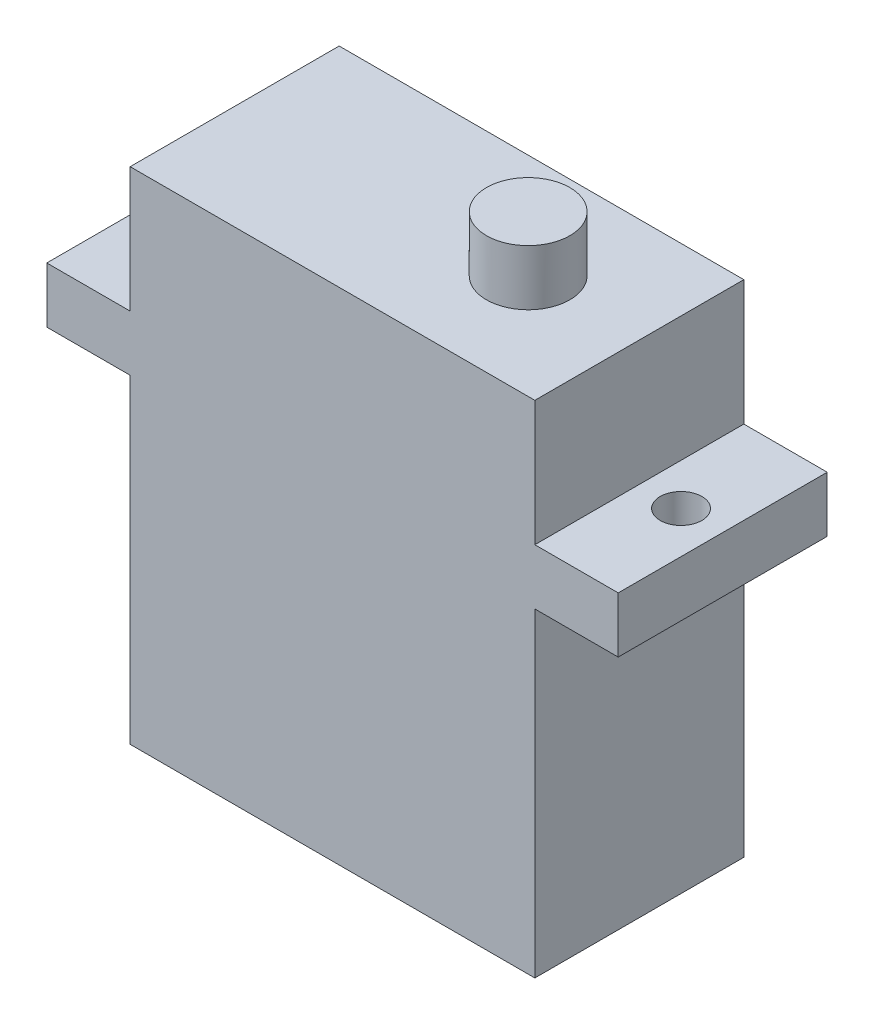
ISO-10303-21;
HEADER;
FILE_DESCRIPTION(('STEP AP214'),'2;1');
FILE_NAME('part.step','',(''),(''),'','','');
FILE_SCHEMA(('AUTOMOTIVE_DESIGN { 1 0 10303 214 1 1 1 1 }'));
ENDSEC;
DATA;
#1=APPLICATION_CONTEXT('core data for automotive mechanical design processes');
#2=APPLICATION_PROTOCOL_DEFINITION('international standard','automotive_design',2000,#1);
#3=PRODUCT_CONTEXT('',#1,'mechanical');
#4=PRODUCT('Part','Part','',(#3));
#5=PRODUCT_RELATED_PRODUCT_CATEGORY('part','',(#4));
#6=PRODUCT_DEFINITION_FORMATION('','',#4);
#7=PRODUCT_DEFINITION_CONTEXT('part definition',#1,'design');
#8=PRODUCT_DEFINITION('design','',#6,#7);
#9=PRODUCT_DEFINITION_SHAPE('','',#8);
#10=(LENGTH_UNIT() NAMED_UNIT(*) SI_UNIT(.MILLI.,.METRE.));
#11=(NAMED_UNIT(*) PLANE_ANGLE_UNIT() SI_UNIT($,.RADIAN.));
#12=(NAMED_UNIT(*) SI_UNIT($,.STERADIAN.) SOLID_ANGLE_UNIT());
#13=UNCERTAINTY_MEASURE_WITH_UNIT(LENGTH_MEASURE(1.E-05),#10,'distance_accuracy_value','');
#14=(GEOMETRIC_REPRESENTATION_CONTEXT(3) GLOBAL_UNCERTAINTY_ASSIGNED_CONTEXT((#13)) GLOBAL_UNIT_ASSIGNED_CONTEXT((#10,
#11,#12)) REPRESENTATION_CONTEXT('',''));
#15=CARTESIAN_POINT('',(0.,0.,0.));
#16=DIRECTION('',(0.,0.,1.));
#17=DIRECTION('',(1.,0.,0.));
#18=AXIS2_PLACEMENT_3D('',#15,#16,#17);
#19=CARTESIAN_POINT('',(-11.557,28.575,-5.969));
#20=DIRECTION('',(1.,0.,0.));
#21=DIRECTION('',(0.,0.,-1.));
#22=AXIS2_PLACEMENT_3D('',#19,#20,#21);
#23=PLANE('',#22);
#24=DIRECTION('',(0.,0.,1.));
#25=VECTOR('',#24,1.);
#26=CARTESIAN_POINT('',(-11.557,18.25625,-5.969));
#27=LINE('',#26,#25);
#28=CARTESIAN_POINT('',(-11.557,18.25625,-5.969));
#29=VERTEX_POINT('',#28);
#30=CARTESIAN_POINT('',(-11.557,18.25625,5.969));
#31=VERTEX_POINT('',#30);
#32=EDGE_CURVE('E131',#29,#31,#27,.T.);
#33=ORIENTED_EDGE('',*,*,#32,.F.);
#34=DIRECTION('',(0.,-1.,0.));
#35=VECTOR('',#34,1.);
#36=CARTESIAN_POINT('',(-11.557,28.575,-5.969));
#37=LINE('',#36,#35);
#38=CARTESIAN_POINT('',(-11.557,0.,-5.969));
#39=VERTEX_POINT('',#38);
#40=EDGE_CURVE('E144',#29,#39,#37,.T.);
#41=ORIENTED_EDGE('',*,*,#40,.T.);
#42=DIRECTION('',(0.,0.,1.));
#43=VECTOR('',#42,1.);
#44=CARTESIAN_POINT('',(-11.557,0.,-5.969));
#45=LINE('',#44,#43);
#46=CARTESIAN_POINT('',(-11.557,0.,5.969));
#47=VERTEX_POINT('',#46);
#48=EDGE_CURVE('E187',#39,#47,#45,.T.);
#49=ORIENTED_EDGE('',*,*,#48,.T.);
#50=DIRECTION('',(0.,-1.,0.));
#51=VECTOR('',#50,1.);
#52=CARTESIAN_POINT('',(-11.557,28.575,5.969));
#53=LINE('',#52,#51);
#54=EDGE_CURVE('E146',#31,#47,#53,.T.);
#55=ORIENTED_EDGE('',*,*,#54,.F.);
#56=EDGE_LOOP('',(#33,#41,#49,#55));
#57=FACE_BOUND('',#56,.T.);
#58=ADVANCED_FACE('F39',(#57),#23,.F.);
#59=CARTESIAN_POINT('',(11.557,28.575,-5.969));
#60=DIRECTION('',(1.,0.,0.));
#61=DIRECTION('',(0.,0.,-1.));
#62=AXIS2_PLACEMENT_3D('',#59,#60,#61);
#63=PLANE('',#62);
#64=DIRECTION('',(0.,-1.,0.));
#65=VECTOR('',#64,1.);
#66=CARTESIAN_POINT('',(11.557,28.575,-5.969));
#67=LINE('',#66,#65);
#68=CARTESIAN_POINT('',(11.557,18.25625,-5.969));
#69=VERTEX_POINT('',#68);
#70=CARTESIAN_POINT('',(11.557,0.,-5.969));
#71=VERTEX_POINT('',#70);
#72=EDGE_CURVE('E158',#69,#71,#67,.T.);
#73=ORIENTED_EDGE('',*,*,#72,.F.);
#74=DIRECTION('',(0.,0.,1.));
#75=VECTOR('',#74,1.);
#76=CARTESIAN_POINT('',(11.557,18.25625,-5.969));
#77=LINE('',#76,#75);
#78=CARTESIAN_POINT('',(11.557,18.25625,5.969));
#79=VERTEX_POINT('',#78);
#80=EDGE_CURVE('E179',#69,#79,#77,.T.);
#81=ORIENTED_EDGE('',*,*,#80,.T.);
#82=DIRECTION('',(0.,-1.,0.));
#83=VECTOR('',#82,1.);
#84=CARTESIAN_POINT('',(11.557,28.575,5.969));
#85=LINE('',#84,#83);
#86=CARTESIAN_POINT('',(11.557,0.,5.969));
#87=VERTEX_POINT('',#86);
#88=EDGE_CURVE('E165',#79,#87,#85,.T.);
#89=ORIENTED_EDGE('',*,*,#88,.T.);
#90=DIRECTION('',(0.,0.,1.));
#91=VECTOR('',#90,1.);
#92=CARTESIAN_POINT('',(11.557,0.,-5.969));
#93=LINE('',#92,#91);
#94=EDGE_CURVE('E178',#71,#87,#93,.T.);
#95=ORIENTED_EDGE('',*,*,#94,.F.);
#96=EDGE_LOOP('',(#73,#81,#89,#95));
#97=FACE_BOUND('',#96,.T.);
#98=ADVANCED_FACE('F176',(#97),#63,.T.);
#99=CARTESIAN_POINT('',(-11.557,28.575,5.969));
#100=DIRECTION('',(0.,0.,-1.));
#101=DIRECTION('',(-1.,0.,0.));
#102=AXIS2_PLACEMENT_3D('',#99,#100,#101);
#103=PLANE('',#102);
#104=DIRECTION('',(1.,0.,0.));
#105=VECTOR('',#104,1.);
#106=CARTESIAN_POINT('',(-11.557,0.,5.969));
#107=LINE('',#106,#105);
#108=EDGE_CURVE('E182',#47,#87,#107,.T.);
#109=ORIENTED_EDGE('',*,*,#108,.T.);
#110=ORIENTED_EDGE('',*,*,#88,.F.);
#111=DIRECTION('',(1.,0.,0.));
#112=VECTOR('',#111,1.);
#113=CARTESIAN_POINT('',(11.557,18.25625,5.969));
#114=LINE('',#113,#112);
#115=CARTESIAN_POINT('',(16.3195,18.25625,5.969));
#116=VERTEX_POINT('',#115);
#117=EDGE_CURVE('E62',#79,#116,#114,.T.);
#118=ORIENTED_EDGE('',*,*,#117,.T.);
#119=DIRECTION('',(0.,-1.,0.));
#120=VECTOR('',#119,1.);
#121=CARTESIAN_POINT('',(16.3195,21.43125,5.969));
#122=LINE('',#121,#120);
#123=CARTESIAN_POINT('',(16.3195,21.43125,5.969));
#124=VERTEX_POINT('',#123);
#125=EDGE_CURVE('E238',#124,#116,#122,.T.);
#126=ORIENTED_EDGE('',*,*,#125,.F.);
#127=DIRECTION('',(1.,0.,0.));
#128=VECTOR('',#127,1.);
#129=CARTESIAN_POINT('',(11.557,21.43125,5.969));
#130=LINE('',#129,#128);
#131=CARTESIAN_POINT('',(11.557,21.43125,5.969));
#132=VERTEX_POINT('',#131);
#133=EDGE_CURVE('E212',#132,#124,#130,.T.);
#134=ORIENTED_EDGE('',*,*,#133,.F.);
#135=CARTESIAN_POINT('',(11.557,28.575,5.969));
#136=VERTEX_POINT('',#135);
#137=EDGE_CURVE('E47',#136,#132,#85,.T.);
#138=ORIENTED_EDGE('',*,*,#137,.F.);
#139=DIRECTION('',(1.,0.,0.));
#140=VECTOR('',#139,1.);
#141=CARTESIAN_POINT('',(-11.557,28.575,5.969));
#142=LINE('',#141,#140);
#143=CARTESIAN_POINT('',(-11.557,28.575,5.969));
#144=VERTEX_POINT('',#143);
#145=EDGE_CURVE('E190',#144,#136,#142,.T.);
#146=ORIENTED_EDGE('',*,*,#145,.F.);
#147=CARTESIAN_POINT('',(-11.557,21.43125,5.969));
#148=VERTEX_POINT('',#147);
#149=EDGE_CURVE('E155',#144,#148,#53,.T.);
#150=ORIENTED_EDGE('',*,*,#149,.T.);
#151=DIRECTION('',(-1.,0.,0.));
#152=VECTOR('',#151,1.);
#153=CARTESIAN_POINT('',(-11.557,21.43125,5.969));
#154=LINE('',#153,#152);
#155=CARTESIAN_POINT('',(-16.3195,21.43125,5.969));
#156=VERTEX_POINT('',#155);
#157=EDGE_CURVE('E54',#148,#156,#154,.T.);
#158=ORIENTED_EDGE('',*,*,#157,.T.);
#159=DIRECTION('',(0.,-1.,0.));
#160=VECTOR('',#159,1.);
#161=CARTESIAN_POINT('',(-16.3195,21.43125,5.969));
#162=LINE('',#161,#160);
#163=CARTESIAN_POINT('',(-16.3195,18.25625,5.969));
#164=VERTEX_POINT('',#163);
#165=EDGE_CURVE('E139',#156,#164,#162,.T.);
#166=ORIENTED_EDGE('',*,*,#165,.T.);
#167=DIRECTION('',(-1.,0.,0.));
#168=VECTOR('',#167,1.);
#169=CARTESIAN_POINT('',(-11.557,18.25625,5.969));
#170=LINE('',#169,#168);
#171=EDGE_CURVE('E220',#31,#164,#170,.T.);
#172=ORIENTED_EDGE('',*,*,#171,.F.);
#173=ORIENTED_EDGE('',*,*,#54,.T.);
#174=EDGE_LOOP('',(#109,#110,#118,#126,#134,#138,#146,#150,#158,#166,#172,#173));
#175=FACE_BOUND('',#174,.T.);
#176=ADVANCED_FACE('F41',(#175),#103,.F.);
#177=DIRECTION('',(0.,0.,1.));
#178=VECTOR('',#177,1.);
#179=CARTESIAN_POINT('',(11.557,21.43125,-5.969));
#180=LINE('',#179,#178);
#181=CARTESIAN_POINT('',(11.557,21.43125,-5.969));
#182=VERTEX_POINT('',#181);
#183=EDGE_CURVE('E243',#182,#132,#180,.T.);
#184=ORIENTED_EDGE('',*,*,#183,.F.);
#185=CARTESIAN_POINT('',(11.557,28.575,-5.969));
#186=VERTEX_POINT('',#185);
#187=EDGE_CURVE('E163',#186,#182,#67,.T.);
#188=ORIENTED_EDGE('',*,*,#187,.F.);
#189=DIRECTION('',(0.,0.,1.));
#190=VECTOR('',#189,1.);
#191=CARTESIAN_POINT('',(11.557,28.575,-5.969));
#192=LINE('',#191,#190);
#193=EDGE_CURVE('E191',#186,#136,#192,.T.);
#194=ORIENTED_EDGE('',*,*,#193,.T.);
#195=ORIENTED_EDGE('',*,*,#137,.T.);
#196=EDGE_LOOP('',(#184,#188,#194,#195));
#197=FACE_BOUND('',#196,.T.);
#198=ADVANCED_FACE('F213',(#197),#63,.T.);
#199=CARTESIAN_POINT('',(-11.557,28.575,-5.969));
#200=DIRECTION('',(0.,0.,-1.));
#201=DIRECTION('',(-1.,0.,0.));
#202=AXIS2_PLACEMENT_3D('',#199,#200,#201);
#203=PLANE('',#202);
#204=DIRECTION('',(1.,0.,0.));
#205=VECTOR('',#204,1.);
#206=CARTESIAN_POINT('',(-11.557,0.,-5.969));
#207=LINE('',#206,#205);
#208=EDGE_CURVE('E153',#39,#71,#207,.T.);
#209=ORIENTED_EDGE('',*,*,#208,.F.);
#210=ORIENTED_EDGE('',*,*,#40,.F.);
#211=DIRECTION('',(-1.,0.,0.));
#212=VECTOR('',#211,1.);
#213=CARTESIAN_POINT('',(-11.557,18.25625,-5.969));
#214=LINE('',#213,#212);
#215=CARTESIAN_POINT('',(-16.3195,18.25625,-5.969));
#216=VERTEX_POINT('',#215);
#217=EDGE_CURVE('E127',#29,#216,#214,.T.);
#218=ORIENTED_EDGE('',*,*,#217,.T.);
#219=DIRECTION('',(0.,-1.,0.));
#220=VECTOR('',#219,1.);
#221=CARTESIAN_POINT('',(-16.3195,21.43125,-5.969));
#222=LINE('',#221,#220);
#223=CARTESIAN_POINT('',(-16.3195,21.43125,-5.969));
#224=VERTEX_POINT('',#223);
#225=EDGE_CURVE('E148',#224,#216,#222,.T.);
#226=ORIENTED_EDGE('',*,*,#225,.F.);
#227=DIRECTION('',(-1.,0.,0.));
#228=VECTOR('',#227,1.);
#229=CARTESIAN_POINT('',(-11.557,21.43125,-5.969));
#230=LINE('',#229,#228);
#231=CARTESIAN_POINT('',(-11.557,21.43125,-5.969));
#232=VERTEX_POINT('',#231);
#233=EDGE_CURVE('E138',#232,#224,#230,.T.);
#234=ORIENTED_EDGE('',*,*,#233,.F.);
#235=CARTESIAN_POINT('',(-11.557,28.575,-5.969));
#236=VERTEX_POINT('',#235);
#237=EDGE_CURVE('E154',#236,#232,#37,.T.);
#238=ORIENTED_EDGE('',*,*,#237,.F.);
#239=DIRECTION('',(1.,0.,0.));
#240=VECTOR('',#239,1.);
#241=CARTESIAN_POINT('',(-11.557,28.575,-5.969));
#242=LINE('',#241,#240);
#243=EDGE_CURVE('E196',#236,#186,#242,.T.);
#244=ORIENTED_EDGE('',*,*,#243,.T.);
#245=ORIENTED_EDGE('',*,*,#187,.T.);
#246=DIRECTION('',(1.,0.,0.));
#247=VECTOR('',#246,1.);
#248=CARTESIAN_POINT('',(11.557,21.43125,-5.969));
#249=LINE('',#248,#247);
#250=CARTESIAN_POINT('',(16.3195,21.43125,-5.969));
#251=VERTEX_POINT('',#250);
#252=EDGE_CURVE('E235',#182,#251,#249,.T.);
#253=ORIENTED_EDGE('',*,*,#252,.T.);
#254=DIRECTION('',(0.,-1.,0.));
#255=VECTOR('',#254,1.);
#256=CARTESIAN_POINT('',(16.3195,21.43125,-5.969));
#257=LINE('',#256,#255);
#258=CARTESIAN_POINT('',(16.3195,18.25625,-5.969));
#259=VERTEX_POINT('',#258);
#260=EDGE_CURVE('E233',#251,#259,#257,.T.);
#261=ORIENTED_EDGE('',*,*,#260,.T.);
#262=DIRECTION('',(1.,0.,0.));
#263=VECTOR('',#262,1.);
#264=CARTESIAN_POINT('',(11.557,18.25625,-5.969));
#265=LINE('',#264,#263);
#266=EDGE_CURVE('E230',#69,#259,#265,.T.);
#267=ORIENTED_EDGE('',*,*,#266,.F.);
#268=ORIENTED_EDGE('',*,*,#72,.T.);
#269=EDGE_LOOP('',(#209,#210,#218,#226,#234,#238,#244,#245,#253,#261,#267,#268));
#270=FACE_BOUND('',#269,.T.);
#271=ADVANCED_FACE('F151',(#270),#203,.T.);
#272=ORIENTED_EDGE('',*,*,#237,.T.);
#273=DIRECTION('',(0.,0.,1.));
#274=VECTOR('',#273,1.);
#275=CARTESIAN_POINT('',(-11.557,21.43125,-5.969));
#276=LINE('',#275,#274);
#277=EDGE_CURVE('E147',#232,#148,#276,.T.);
#278=ORIENTED_EDGE('',*,*,#277,.T.);
#279=ORIENTED_EDGE('',*,*,#149,.F.);
#280=DIRECTION('',(0.,0.,1.));
#281=VECTOR('',#280,1.);
#282=CARTESIAN_POINT('',(-11.557,28.575,-5.969));
#283=LINE('',#282,#281);
#284=EDGE_CURVE('E203',#236,#144,#283,.T.);
#285=ORIENTED_EDGE('',*,*,#284,.F.);
#286=EDGE_LOOP('',(#272,#278,#279,#285));
#287=FACE_BOUND('',#286,.T.);
#288=ADVANCED_FACE('F209',(#287),#23,.F.);
#289=CARTESIAN_POINT('',(0.,28.575,0.));
#290=DIRECTION('',(0.,-1.,0.));
#291=DIRECTION('',(0.,0.,-1.));
#292=AXIS2_PLACEMENT_3D('',#289,#290,#291);
#293=PLANE('',#292);
#294=CARTESIAN_POINT('',(5.207,28.575,0.));
#295=DIRECTION('',(0.,-1.,0.));
#296=DIRECTION('',(0.,0.,-1.));
#297=AXIS2_PLACEMENT_3D('',#294,#295,#296);
#298=CIRCLE('',#297,2.38125);
#299=CARTESIAN_POINT('',(5.207,28.575,-2.38125));
#300=VERTEX_POINT('',#299);
#301=EDGE_CURVE('E11',#300,#300,#298,.F.);
#302=ORIENTED_EDGE('',*,*,#301,.F.);
#303=EDGE_LOOP('',(#302));
#304=FACE_BOUND('',#303,.T.);
#305=ORIENTED_EDGE('',*,*,#145,.T.);
#306=ORIENTED_EDGE('',*,*,#193,.F.);
#307=ORIENTED_EDGE('',*,*,#243,.F.);
#308=ORIENTED_EDGE('',*,*,#284,.T.);
#309=EDGE_LOOP('',(#305,#306,#307,#308));
#310=FACE_BOUND('',#309,.T.);
#311=ADVANCED_FACE('F207',(#304,#310),#293,.F.);
#312=CARTESIAN_POINT('',(0.,0.,0.));
#313=DIRECTION('',(0.,-1.,0.));
#314=DIRECTION('',(0.,0.,-1.));
#315=AXIS2_PLACEMENT_3D('',#312,#313,#314);
#316=PLANE('',#315);
#317=ORIENTED_EDGE('',*,*,#108,.F.);
#318=ORIENTED_EDGE('',*,*,#48,.F.);
#319=ORIENTED_EDGE('',*,*,#208,.T.);
#320=ORIENTED_EDGE('',*,*,#94,.T.);
#321=EDGE_LOOP('',(#317,#318,#319,#320));
#322=FACE_BOUND('',#321,.T.);
#323=ADVANCED_FACE('F185',(#322),#316,.T.);
#324=CARTESIAN_POINT('',(11.557,18.25625,-5.969));
#325=DIRECTION('',(0.,-1.,0.));
#326=DIRECTION('',(1.,0.,0.));
#327=AXIS2_PLACEMENT_3D('',#324,#325,#326);
#328=PLANE('',#327);
#329=CARTESIAN_POINT('',(13.93825,18.25625,0.));
#330=DIRECTION('',(0.,-1.,0.));
#331=DIRECTION('',(1.,0.,0.));
#332=AXIS2_PLACEMENT_3D('',#329,#330,#331);
#333=CIRCLE('',#332,1.190625);
#334=CARTESIAN_POINT('',(15.128875,18.25625,0.));
#335=VERTEX_POINT('',#334);
#336=EDGE_CURVE('E381',#335,#335,#333,.T.);
#337=ORIENTED_EDGE('',*,*,#336,.F.);
#338=EDGE_LOOP('',(#337));
#339=FACE_BOUND('',#338,.T.);
#340=ORIENTED_EDGE('',*,*,#117,.F.);
#341=ORIENTED_EDGE('',*,*,#80,.F.);
#342=ORIENTED_EDGE('',*,*,#266,.T.);
#343=DIRECTION('',(0.,0.,1.));
#344=VECTOR('',#343,1.);
#345=CARTESIAN_POINT('',(16.3195,18.25625,-5.969));
#346=LINE('',#345,#344);
#347=EDGE_CURVE('E199',#259,#116,#346,.T.);
#348=ORIENTED_EDGE('',*,*,#347,.T.);
#349=EDGE_LOOP('',(#340,#341,#342,#348));
#350=FACE_BOUND('',#349,.T.);
#351=ADVANCED_FACE('F250',(#339,#350),#328,.T.);
#352=CARTESIAN_POINT('',(11.557,21.43125,-5.969));
#353=DIRECTION('',(0.,-1.,0.));
#354=DIRECTION('',(0.,0.,-1.));
#355=AXIS2_PLACEMENT_3D('',#352,#353,#354);
#356=PLANE('',#355);
#357=CARTESIAN_POINT('',(13.93825,21.43125,0.));
#358=DIRECTION('',(0.,1.,0.));
#359=DIRECTION('',(0.,0.,1.));
#360=AXIS2_PLACEMENT_3D('',#357,#358,#359);
#361=CIRCLE('',#360,1.190625);
#362=CARTESIAN_POINT('',(13.93825,21.43125,1.190625));
#363=VERTEX_POINT('',#362);
#364=EDGE_CURVE('E378',#363,#363,#361,.T.);
#365=ORIENTED_EDGE('',*,*,#364,.F.);
#366=EDGE_LOOP('',(#365));
#367=FACE_BOUND('',#366,.T.);
#368=ORIENTED_EDGE('',*,*,#133,.T.);
#369=DIRECTION('',(0.,0.,1.));
#370=VECTOR('',#369,1.);
#371=CARTESIAN_POINT('',(16.3195,21.43125,-5.969));
#372=LINE('',#371,#370);
#373=EDGE_CURVE('E244',#251,#124,#372,.T.);
#374=ORIENTED_EDGE('',*,*,#373,.F.);
#375=ORIENTED_EDGE('',*,*,#252,.F.);
#376=ORIENTED_EDGE('',*,*,#183,.T.);
#377=EDGE_LOOP('',(#368,#374,#375,#376));
#378=FACE_BOUND('',#377,.T.);
#379=ADVANCED_FACE('F254',(#367,#378),#356,.F.);
#380=CARTESIAN_POINT('',(16.3195,21.43125,-5.969));
#381=DIRECTION('',(-1.,0.,0.));
#382=DIRECTION('',(0.,-1.,0.));
#383=AXIS2_PLACEMENT_3D('',#380,#381,#382);
#384=PLANE('',#383);
#385=ORIENTED_EDGE('',*,*,#125,.T.);
#386=ORIENTED_EDGE('',*,*,#347,.F.);
#387=ORIENTED_EDGE('',*,*,#260,.F.);
#388=ORIENTED_EDGE('',*,*,#373,.T.);
#389=EDGE_LOOP('',(#385,#386,#387,#388));
#390=FACE_BOUND('',#389,.T.);
#391=ADVANCED_FACE('F252',(#390),#384,.F.);
#392=CARTESIAN_POINT('',(-11.557,18.25625,-5.969));
#393=DIRECTION('',(0.,1.,0.));
#394=DIRECTION('',(-1.,0.,0.));
#395=AXIS2_PLACEMENT_3D('',#392,#393,#394);
#396=PLANE('',#395);
#397=CARTESIAN_POINT('',(-13.93825,18.25625,0.));
#398=DIRECTION('',(0.,1.,0.));
#399=DIRECTION('',(-1.,0.,0.));
#400=AXIS2_PLACEMENT_3D('',#397,#398,#399);
#401=CIRCLE('',#400,1.190625);
#402=CARTESIAN_POINT('',(-15.128875,18.25625,0.));
#403=VERTEX_POINT('',#402);
#404=EDGE_CURVE('E377',#403,#403,#401,.F.);
#405=ORIENTED_EDGE('',*,*,#404,.F.);
#406=EDGE_LOOP('',(#405));
#407=FACE_BOUND('',#406,.T.);
#408=ORIENTED_EDGE('',*,*,#171,.T.);
#409=DIRECTION('',(0.,0.,1.));
#410=VECTOR('',#409,1.);
#411=CARTESIAN_POINT('',(-16.3195,18.25625,-5.969));
#412=LINE('',#411,#410);
#413=EDGE_CURVE('E133',#216,#164,#412,.T.);
#414=ORIENTED_EDGE('',*,*,#413,.F.);
#415=ORIENTED_EDGE('',*,*,#217,.F.);
#416=ORIENTED_EDGE('',*,*,#32,.T.);
#417=EDGE_LOOP('',(#408,#414,#415,#416));
#418=FACE_BOUND('',#417,.T.);
#419=ADVANCED_FACE('F130',(#407,#418),#396,.F.);
#420=CARTESIAN_POINT('',(-16.3195,21.43125,-5.969));
#421=DIRECTION('',(-1.,0.,0.));
#422=DIRECTION('',(0.,-1.,0.));
#423=AXIS2_PLACEMENT_3D('',#420,#421,#422);
#424=PLANE('',#423);
#425=ORIENTED_EDGE('',*,*,#165,.F.);
#426=DIRECTION('',(0.,0.,1.));
#427=VECTOR('',#426,1.);
#428=CARTESIAN_POINT('',(-16.3195,21.43125,-5.969));
#429=LINE('',#428,#427);
#430=EDGE_CURVE('E227',#224,#156,#429,.T.);
#431=ORIENTED_EDGE('',*,*,#430,.F.);
#432=ORIENTED_EDGE('',*,*,#225,.T.);
#433=ORIENTED_EDGE('',*,*,#413,.T.);
#434=EDGE_LOOP('',(#425,#431,#432,#433));
#435=FACE_BOUND('',#434,.T.);
#436=ADVANCED_FACE('F261',(#435),#424,.T.);
#437=CARTESIAN_POINT('',(-11.557,21.43125,-5.969));
#438=DIRECTION('',(0.,1.,0.));
#439=DIRECTION('',(0.,0.,1.));
#440=AXIS2_PLACEMENT_3D('',#437,#438,#439);
#441=PLANE('',#440);
#442=CARTESIAN_POINT('',(-13.93825,21.43125,0.));
#443=DIRECTION('',(0.,-1.,0.));
#444=DIRECTION('',(0.,0.,1.));
#445=AXIS2_PLACEMENT_3D('',#442,#443,#444);
#446=CIRCLE('',#445,1.190625);
#447=CARTESIAN_POINT('',(-13.93825,21.43125,1.190625));
#448=VERTEX_POINT('',#447);
#449=EDGE_CURVE('E374',#448,#448,#446,.T.);
#450=ORIENTED_EDGE('',*,*,#449,.T.);
#451=EDGE_LOOP('',(#450));
#452=FACE_BOUND('',#451,.T.);
#453=ORIENTED_EDGE('',*,*,#157,.F.);
#454=ORIENTED_EDGE('',*,*,#277,.F.);
#455=ORIENTED_EDGE('',*,*,#233,.T.);
#456=ORIENTED_EDGE('',*,*,#430,.T.);
#457=EDGE_LOOP('',(#453,#454,#455,#456));
#458=FACE_BOUND('',#457,.T.);
#459=ADVANCED_FACE('F319',(#452,#458),#441,.T.);
#460=CARTESIAN_POINT('',(5.207,31.75,0.));
#461=DIRECTION('',(0.,-1.,0.));
#462=DIRECTION('',(0.,0.,-1.));
#463=AXIS2_PLACEMENT_3D('',#460,#461,#462);
#464=CYLINDRICAL_SURFACE('',#463,2.38125);
#465=CARTESIAN_POINT('',(5.207,31.75,0.));
#466=DIRECTION('',(0.,1.,0.));
#467=DIRECTION('',(0.,0.,1.));
#468=AXIS2_PLACEMENT_3D('',#465,#466,#467);
#469=CIRCLE('',#468,2.38125);
#470=CARTESIAN_POINT('',(5.207,31.75,2.38125));
#471=VERTEX_POINT('',#470);
#472=EDGE_CURVE('E222',#471,#471,#469,.T.);
#473=ORIENTED_EDGE('',*,*,#472,.F.);
#474=EDGE_LOOP('',(#473));
#475=FACE_BOUND('',#474,.T.);
#476=ORIENTED_EDGE('',*,*,#301,.T.);
#477=EDGE_LOOP('',(#476));
#478=FACE_BOUND('',#477,.T.);
#479=ADVANCED_FACE('F328',(#475,#478),#464,.T.);
#480=CARTESIAN_POINT('',(5.207,31.75,0.));
#481=DIRECTION('',(0.,1.,0.));
#482=DIRECTION('',(0.,0.,1.));
#483=AXIS2_PLACEMENT_3D('',#480,#481,#482);
#484=PLANE('',#483);
#485=ORIENTED_EDGE('',*,*,#472,.T.);
#486=EDGE_LOOP('',(#485));
#487=FACE_BOUND('',#486,.T.);
#488=ADVANCED_FACE('F339',(#487),#484,.T.);
#489=CARTESIAN_POINT('',(13.93825,0.,0.));
#490=DIRECTION('',(0.,1.,0.));
#491=DIRECTION('',(0.,0.,1.));
#492=AXIS2_PLACEMENT_3D('',#489,#490,#491);
#493=CYLINDRICAL_SURFACE('',#492,1.190625);
#494=ORIENTED_EDGE('',*,*,#336,.T.);
#495=EDGE_LOOP('',(#494));
#496=FACE_BOUND('',#495,.T.);
#497=ORIENTED_EDGE('',*,*,#364,.T.);
#498=EDGE_LOOP('',(#497));
#499=FACE_BOUND('',#498,.T.);
#500=ADVANCED_FACE('F349',(#496,#499),#493,.F.);
#501=CARTESIAN_POINT('',(-13.93825,0.,0.));
#502=DIRECTION('',(0.,1.,0.));
#503=DIRECTION('',(0.,0.,1.));
#504=AXIS2_PLACEMENT_3D('',#501,#502,#503);
#505=CYLINDRICAL_SURFACE('',#504,1.190625);
#506=ORIENTED_EDGE('',*,*,#449,.F.);
#507=EDGE_LOOP('',(#506));
#508=FACE_BOUND('',#507,.T.);
#509=ORIENTED_EDGE('',*,*,#404,.T.);
#510=EDGE_LOOP('',(#509));
#511=FACE_BOUND('',#510,.T.);
#512=ADVANCED_FACE('F359',(#508,#511),#505,.F.);
#513=CLOSED_SHELL('',(#58,#98,#176,#198,#271,#288,#311,#323,#351,#379,#391,#419,#436,#459,#479,
#488,#500,#512));
#514=MANIFOLD_SOLID_BREP('B2',#513);
#515=ADVANCED_BREP_SHAPE_REPRESENTATION('',(#18,#514),#14);
#516=SHAPE_DEFINITION_REPRESENTATION(#9,#515);
ENDSEC;
END-ISO-10303-21;
